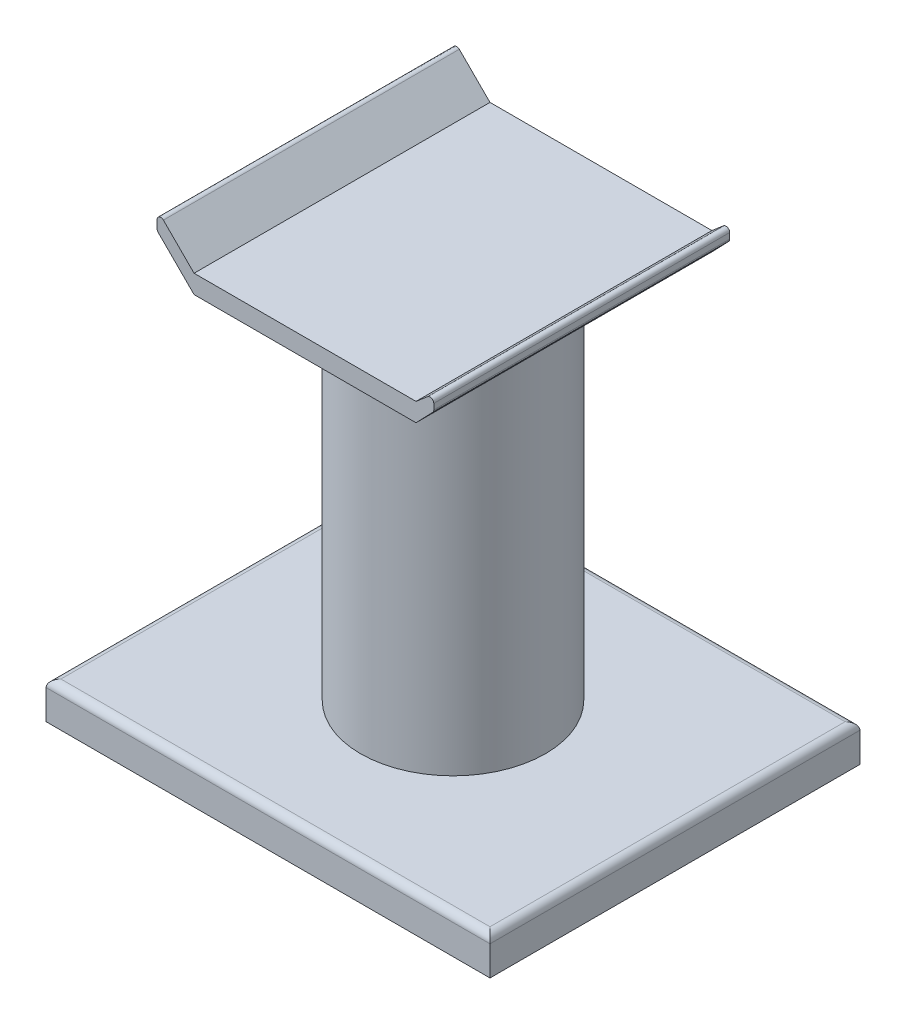
ISO-10303-21;
HEADER;
FILE_DESCRIPTION(('STEP AP214'),'2;1');
FILE_NAME('part.step','',(''),(''),'','','');
FILE_SCHEMA(('AUTOMOTIVE_DESIGN { 1 0 10303 214 1 1 1 1 }'));
ENDSEC;
DATA;
#1=APPLICATION_CONTEXT('core data for automotive mechanical design processes');
#2=APPLICATION_PROTOCOL_DEFINITION('international standard','automotive_design',2000,#1);
#3=PRODUCT_CONTEXT('',#1,'mechanical');
#4=PRODUCT('Part','Part','',(#3));
#5=PRODUCT_RELATED_PRODUCT_CATEGORY('part','',(#4));
#6=PRODUCT_DEFINITION_FORMATION('','',#4);
#7=PRODUCT_DEFINITION_CONTEXT('part definition',#1,'design');
#8=PRODUCT_DEFINITION('design','',#6,#7);
#9=PRODUCT_DEFINITION_SHAPE('','',#8);
#10=(LENGTH_UNIT() NAMED_UNIT(*) SI_UNIT(.MILLI.,.METRE.));
#11=(NAMED_UNIT(*) PLANE_ANGLE_UNIT() SI_UNIT($,.RADIAN.));
#12=(NAMED_UNIT(*) SI_UNIT($,.STERADIAN.) SOLID_ANGLE_UNIT());
#13=UNCERTAINTY_MEASURE_WITH_UNIT(LENGTH_MEASURE(1.E-05),#10,'distance_accuracy_value','');
#14=(GEOMETRIC_REPRESENTATION_CONTEXT(3) GLOBAL_UNCERTAINTY_ASSIGNED_CONTEXT((#13)) GLOBAL_UNIT_ASSIGNED_CONTEXT((#10,
#11,#12)) REPRESENTATION_CONTEXT('',''));
#15=CARTESIAN_POINT('',(0.,0.,0.));
#16=DIRECTION('',(0.,0.,1.));
#17=DIRECTION('',(1.,0.,0.));
#18=AXIS2_PLACEMENT_3D('',#15,#16,#17);
#19=CARTESIAN_POINT('',(0.,8.,-48.));
#20=DIRECTION('',(1.,0.,0.));
#21=DIRECTION('',(0.,0.,-1.));
#22=AXIS2_PLACEMENT_3D('',#19,#20,#21);
#23=CYLINDRICAL_SURFACE('',#22,2.);
#24=CARTESIAN_POINT('',(-58.,8.,-48.));
#25=DIRECTION('',(0.707106781186547,0.,-0.707106781186547));
#26=DIRECTION('',(-0.707106781186547,0.,-0.707106781186547));
#27=AXIS2_PLACEMENT_3D('',#24,#25,#26);
#28=ELLIPSE('',#27,2.82842712474619,2.);
#29=CARTESIAN_POINT('',(-58.,10.,-48.));
#30=VERTEX_POINT('',#29);
#31=CARTESIAN_POINT('',(-60.,8.,-50.));
#32=VERTEX_POINT('',#31);
#33=EDGE_CURVE('E11',#30,#32,#28,.F.);
#34=ORIENTED_EDGE('',*,*,#33,.F.);
#35=DIRECTION('',(-1.,0.,0.));
#36=VECTOR('',#35,1.);
#37=CARTESIAN_POINT('',(0.,10.,-48.));
#38=LINE('',#37,#36);
#39=CARTESIAN_POINT('',(58.,10.,-48.));
#40=VERTEX_POINT('',#39);
#41=EDGE_CURVE('E290',#40,#30,#38,.T.);
#42=ORIENTED_EDGE('',*,*,#41,.F.);
#43=CARTESIAN_POINT('',(58.,8.,-48.));
#44=DIRECTION('',(0.707106781186548,0.,0.707106781186547));
#45=DIRECTION('',(0.707106781186547,0.,-0.707106781186547));
#46=AXIS2_PLACEMENT_3D('',#43,#44,#45);
#47=ELLIPSE('',#46,2.82842712474619,2.);
#48=CARTESIAN_POINT('',(60.,8.,-50.));
#49=VERTEX_POINT('',#48);
#50=EDGE_CURVE('E46',#40,#49,#47,.F.);
#51=ORIENTED_EDGE('',*,*,#50,.T.);
#52=DIRECTION('',(-1.,0.,0.));
#53=VECTOR('',#52,1.);
#54=CARTESIAN_POINT('',(0.,8.,-50.));
#55=LINE('',#54,#53);
#56=EDGE_CURVE('E310',#32,#49,#55,.F.);
#57=ORIENTED_EDGE('',*,*,#56,.F.);
#58=EDGE_LOOP('',(#34,#42,#51,#57));
#59=FACE_BOUND('',#58,.T.);
#60=ADVANCED_FACE('F39',(#59),#23,.T.);
#61=CARTESIAN_POINT('',(58.,8.,0.));
#62=DIRECTION('',(0.,0.,1.));
#63=DIRECTION('',(1.,0.,0.));
#64=AXIS2_PLACEMENT_3D('',#61,#62,#63);
#65=CYLINDRICAL_SURFACE('',#64,2.);
#66=ORIENTED_EDGE('',*,*,#50,.F.);
#67=DIRECTION('',(0.,0.,-1.));
#68=VECTOR('',#67,1.);
#69=CARTESIAN_POINT('',(58.,10.,0.));
#70=LINE('',#69,#68);
#71=CARTESIAN_POINT('',(58.,10.,48.));
#72=VERTEX_POINT('',#71);
#73=EDGE_CURVE('E293',#72,#40,#70,.T.);
#74=ORIENTED_EDGE('',*,*,#73,.F.);
#75=CARTESIAN_POINT('',(58.,8.,48.));
#76=DIRECTION('',(-0.707106781186547,0.,0.707106781186548));
#77=DIRECTION('',(0.707106781186548,0.,0.707106781186547));
#78=AXIS2_PLACEMENT_3D('',#75,#76,#77);
#79=ELLIPSE('',#78,2.82842712474619,2.);
#80=CARTESIAN_POINT('',(60.,8.,50.));
#81=VERTEX_POINT('',#80);
#82=EDGE_CURVE('E60',#72,#81,#79,.F.);
#83=ORIENTED_EDGE('',*,*,#82,.T.);
#84=DIRECTION('',(0.,0.,-1.));
#85=VECTOR('',#84,1.);
#86=CARTESIAN_POINT('',(60.,8.,0.));
#87=LINE('',#86,#85);
#88=EDGE_CURVE('E308',#49,#81,#87,.F.);
#89=ORIENTED_EDGE('',*,*,#88,.F.);
#90=EDGE_LOOP('',(#66,#74,#83,#89));
#91=FACE_BOUND('',#90,.T.);
#92=ADVANCED_FACE('F338',(#91),#65,.T.);
#93=CARTESIAN_POINT('',(0.,8.,48.));
#94=DIRECTION('',(-1.,0.,0.));
#95=DIRECTION('',(0.,0.,1.));
#96=AXIS2_PLACEMENT_3D('',#93,#94,#95);
#97=CYLINDRICAL_SURFACE('',#96,2.);
#98=ORIENTED_EDGE('',*,*,#82,.F.);
#99=DIRECTION('',(1.,0.,0.));
#100=VECTOR('',#99,1.);
#101=CARTESIAN_POINT('',(0.,10.,48.));
#102=LINE('',#101,#100);
#103=CARTESIAN_POINT('',(-58.,10.,48.));
#104=VERTEX_POINT('',#103);
#105=EDGE_CURVE('E296',#104,#72,#102,.T.);
#106=ORIENTED_EDGE('',*,*,#105,.F.);
#107=CARTESIAN_POINT('',(-58.,8.,48.));
#108=DIRECTION('',(-0.707106781186547,0.,-0.707106781186547));
#109=DIRECTION('',(-0.707106781186547,0.,0.707106781186548));
#110=AXIS2_PLACEMENT_3D('',#107,#108,#109);
#111=ELLIPSE('',#110,2.82842712474619,2.);
#112=CARTESIAN_POINT('',(-60.,8.,50.));
#113=VERTEX_POINT('',#112);
#114=EDGE_CURVE('E312',#104,#113,#111,.F.);
#115=ORIENTED_EDGE('',*,*,#114,.T.);
#116=DIRECTION('',(1.,0.,0.));
#117=VECTOR('',#116,1.);
#118=CARTESIAN_POINT('',(0.,8.,50.));
#119=LINE('',#118,#117);
#120=EDGE_CURVE('E305',#81,#113,#119,.F.);
#121=ORIENTED_EDGE('',*,*,#120,.F.);
#122=EDGE_LOOP('',(#98,#106,#115,#121));
#123=FACE_BOUND('',#122,.T.);
#124=ADVANCED_FACE('F317',(#123),#97,.T.);
#125=CARTESIAN_POINT('',(-58.,8.,0.));
#126=DIRECTION('',(0.,0.,-1.));
#127=DIRECTION('',(-1.,0.,0.));
#128=AXIS2_PLACEMENT_3D('',#125,#126,#127);
#129=CYLINDRICAL_SURFACE('',#128,2.);
#130=DIRECTION('',(0.,0.,1.));
#131=VECTOR('',#130,1.);
#132=CARTESIAN_POINT('',(-58.,10.,0.));
#133=LINE('',#132,#131);
#134=EDGE_CURVE('E299',#30,#104,#133,.T.);
#135=ORIENTED_EDGE('',*,*,#134,.F.);
#136=ORIENTED_EDGE('',*,*,#33,.T.);
#137=DIRECTION('',(0.,0.,1.));
#138=VECTOR('',#137,1.);
#139=CARTESIAN_POINT('',(-60.,8.,0.));
#140=LINE('',#139,#138);
#141=EDGE_CURVE('E302',#113,#32,#140,.F.);
#142=ORIENTED_EDGE('',*,*,#141,.F.);
#143=ORIENTED_EDGE('',*,*,#114,.F.);
#144=EDGE_LOOP('',(#135,#136,#142,#143));
#145=FACE_BOUND('',#144,.T.);
#146=ADVANCED_FACE('F325',(#145),#129,.T.);
#147=CARTESIAN_POINT('',(33.8051684111036,115.402622656779,-40.0000000000001));
#148=DIRECTION('',(0.,0.,-1.));
#149=DIRECTION('',(-1.,0.,0.));
#150=AXIS2_PLACEMENT_3D('',#147,#148,#149);
#151=CYLINDRICAL_SURFACE('',#150,1.);
#152=DIRECTION('',(0.,0.,-1.));
#153=VECTOR('',#152,1.);
#154=CARTESIAN_POINT('',(34.8051684111036,115.402622656779,-40.0000000000001));
#155=LINE('',#154,#153);
#156=CARTESIAN_POINT('',(34.8051684111036,115.402622656779,40.));
#157=VERTEX_POINT('',#156);
#158=CARTESIAN_POINT('',(34.8051684111036,115.402622656779,-40.0000000000001));
#159=VERTEX_POINT('',#158);
#160=EDGE_CURVE('E282',#157,#159,#155,.T.);
#161=ORIENTED_EDGE('',*,*,#160,.F.);
#162=CARTESIAN_POINT('',(33.8051684111036,115.402622656779,40.));
#163=DIRECTION('',(0.,0.,-1.));
#164=DIRECTION('',(-1.,0.,0.));
#165=AXIS2_PLACEMENT_3D('',#162,#163,#164);
#166=CIRCLE('',#165,1.);
#167=CARTESIAN_POINT('',(34.5261832880233,114.709703074677,40.));
#168=VERTEX_POINT('',#167);
#169=EDGE_CURVE('E286',#168,#157,#166,.F.);
#170=ORIENTED_EDGE('',*,*,#169,.F.);
#171=DIRECTION('',(0.,0.,-1.));
#172=VECTOR('',#171,1.);
#173=CARTESIAN_POINT('',(34.5261832880233,114.709703074677,-40.0000000000001));
#174=LINE('',#173,#172);
#175=CARTESIAN_POINT('',(34.5261832880233,114.709703074677,-40.0000000000001));
#176=VERTEX_POINT('',#175);
#177=EDGE_CURVE('E189',#176,#168,#174,.F.);
#178=ORIENTED_EDGE('',*,*,#177,.F.);
#179=CARTESIAN_POINT('',(33.8051684111036,115.402622656779,-40.));
#180=DIRECTION('',(0.,0.,1.));
#181=DIRECTION('',(1.,0.,0.));
#182=AXIS2_PLACEMENT_3D('',#179,#180,#181);
#183=CIRCLE('',#182,1.);
#184=EDGE_CURVE('E288',#159,#176,#183,.F.);
#185=ORIENTED_EDGE('',*,*,#184,.F.);
#186=EDGE_LOOP('',(#161,#170,#178,#185));
#187=FACE_BOUND('',#186,.T.);
#188=ADVANCED_FACE('F364',(#187),#151,.T.);
#189=CARTESIAN_POINT('',(-39.,120.414213562373,-40.));
#190=DIRECTION('',(0.,0.,1.));
#191=DIRECTION('',(1.,0.,0.));
#192=AXIS2_PLACEMENT_3D('',#189,#190,#191);
#193=CYLINDRICAL_SURFACE('',#192,1.);
#194=DIRECTION('',(0.,0.,1.));
#195=VECTOR('',#194,1.);
#196=CARTESIAN_POINT('',(-40.,120.414213562373,-40.));
#197=LINE('',#196,#195);
#198=CARTESIAN_POINT('',(-40.,120.414213562373,-40.));
#199=VERTEX_POINT('',#198);
#200=CARTESIAN_POINT('',(-40.,120.414213562373,40.));
#201=VERTEX_POINT('',#200);
#202=EDGE_CURVE('E272',#199,#201,#197,.T.);
#203=ORIENTED_EDGE('',*,*,#202,.F.);
#204=CARTESIAN_POINT('',(-39.,120.414213562373,-40.));
#205=DIRECTION('',(0.,0.,1.));
#206=DIRECTION('',(1.,0.,0.));
#207=AXIS2_PLACEMENT_3D('',#204,#205,#206);
#208=CIRCLE('',#207,1.);
#209=CARTESIAN_POINT('',(-39.7071067811865,119.707106781187,-40.));
#210=VERTEX_POINT('',#209);
#211=EDGE_CURVE('E278',#210,#199,#208,.F.);
#212=ORIENTED_EDGE('',*,*,#211,.F.);
#213=DIRECTION('',(0.,0.,1.));
#214=VECTOR('',#213,1.);
#215=CARTESIAN_POINT('',(-39.7071067811865,119.707106781187,-40.));
#216=LINE('',#215,#214);
#217=CARTESIAN_POINT('',(-39.7071067811865,119.707106781187,40.));
#218=VERTEX_POINT('',#217);
#219=EDGE_CURVE('E275',#218,#210,#216,.F.);
#220=ORIENTED_EDGE('',*,*,#219,.F.);
#221=CARTESIAN_POINT('',(-39.,120.414213562373,40.));
#222=DIRECTION('',(0.,0.,-1.));
#223=DIRECTION('',(-1.,0.,0.));
#224=AXIS2_PLACEMENT_3D('',#221,#222,#223);
#225=CIRCLE('',#224,1.);
#226=EDGE_CURVE('E280',#201,#218,#225,.F.);
#227=ORIENTED_EDGE('',*,*,#226,.F.);
#228=EDGE_LOOP('',(#203,#212,#220,#227));
#229=FACE_BOUND('',#228,.T.);
#230=ADVANCED_FACE('F367',(#229),#193,.T.);
#231=CARTESIAN_POINT('',(33.8051684111036,116.93907036714,-40.0000000000001));
#232=DIRECTION('',(0.,0.,-1.));
#233=DIRECTION('',(-1.,0.,0.));
#234=AXIS2_PLACEMENT_3D('',#231,#232,#233);
#235=CYLINDRICAL_SURFACE('',#234,1.);
#236=DIRECTION('',(0.,0.,-1.));
#237=VECTOR('',#236,1.);
#238=CARTESIAN_POINT('',(33.1551306287074,117.698972256503,-40.0000000000001));
#239=LINE('',#238,#237);
#240=CARTESIAN_POINT('',(33.1551306287074,117.698972256503,40.));
#241=VERTEX_POINT('',#240);
#242=CARTESIAN_POINT('',(33.1551306287074,117.698972256503,-40.0000000000001));
#243=VERTEX_POINT('',#242);
#244=EDGE_CURVE('E261',#241,#243,#239,.T.);
#245=ORIENTED_EDGE('',*,*,#244,.F.);
#246=CARTESIAN_POINT('',(33.8051684111036,116.93907036714,40.));
#247=DIRECTION('',(0.,0.,-1.));
#248=DIRECTION('',(-1.,0.,0.));
#249=AXIS2_PLACEMENT_3D('',#246,#247,#248);
#250=CIRCLE('',#249,1.);
#251=CARTESIAN_POINT('',(34.8051684111036,116.93907036714,40.));
#252=VERTEX_POINT('',#251);
#253=EDGE_CURVE('E267',#252,#241,#250,.F.);
#254=ORIENTED_EDGE('',*,*,#253,.F.);
#255=DIRECTION('',(0.,0.,-1.));
#256=VECTOR('',#255,1.);
#257=CARTESIAN_POINT('',(34.8051684111036,116.93907036714,-40.0000000000001));
#258=LINE('',#257,#256);
#259=CARTESIAN_POINT('',(34.8051684111036,116.93907036714,-40.0000000000001));
#260=VERTEX_POINT('',#259);
#261=EDGE_CURVE('E264',#260,#252,#258,.F.);
#262=ORIENTED_EDGE('',*,*,#261,.F.);
#263=CARTESIAN_POINT('',(33.8051684111036,116.93907036714,-40.));
#264=DIRECTION('',(0.,0.,1.));
#265=DIRECTION('',(1.,0.,0.));
#266=AXIS2_PLACEMENT_3D('',#263,#264,#265);
#267=CIRCLE('',#266,1.);
#268=EDGE_CURVE('E269',#243,#260,#267,.F.);
#269=ORIENTED_EDGE('',*,*,#268,.F.);
#270=EDGE_LOOP('',(#245,#254,#262,#269));
#271=FACE_BOUND('',#270,.T.);
#272=ADVANCED_FACE('F371',(#271),#235,.T.);
#273=CARTESIAN_POINT('',(-39.,122.585786437627,-40.));
#274=DIRECTION('',(0.,0.,1.));
#275=DIRECTION('',(1.,0.,0.));
#276=AXIS2_PLACEMENT_3D('',#273,#274,#275);
#277=CYLINDRICAL_SURFACE('',#276,1.);
#278=DIRECTION('',(0.,0.,1.));
#279=VECTOR('',#278,1.);
#280=CARTESIAN_POINT('',(-38.2928932188134,123.292893218813,-40.));
#281=LINE('',#280,#279);
#282=CARTESIAN_POINT('',(-38.2928932188134,123.292893218813,-40.));
#283=VERTEX_POINT('',#282);
#284=CARTESIAN_POINT('',(-38.2928932188134,123.292893218813,40.));
#285=VERTEX_POINT('',#284);
#286=EDGE_CURVE('E232',#283,#285,#281,.T.);
#287=ORIENTED_EDGE('',*,*,#286,.F.);
#288=CARTESIAN_POINT('',(-39.,122.585786437627,-40.));
#289=DIRECTION('',(0.,0.,1.));
#290=DIRECTION('',(1.,0.,0.));
#291=AXIS2_PLACEMENT_3D('',#288,#289,#290);
#292=CIRCLE('',#291,1.);
#293=CARTESIAN_POINT('',(-40.,122.585786437627,-40.));
#294=VERTEX_POINT('',#293);
#295=EDGE_CURVE('E257',#294,#283,#292,.F.);
#296=ORIENTED_EDGE('',*,*,#295,.F.);
#297=DIRECTION('',(0.,0.,1.));
#298=VECTOR('',#297,1.);
#299=CARTESIAN_POINT('',(-40.,122.585786437627,-40.));
#300=LINE('',#299,#298);
#301=CARTESIAN_POINT('',(-40.,122.585786437627,40.));
#302=VERTEX_POINT('',#301);
#303=EDGE_CURVE('E254',#302,#294,#300,.F.);
#304=ORIENTED_EDGE('',*,*,#303,.F.);
#305=CARTESIAN_POINT('',(-39.,122.585786437627,40.));
#306=DIRECTION('',(0.,0.,-1.));
#307=DIRECTION('',(-1.,0.,0.));
#308=AXIS2_PLACEMENT_3D('',#305,#306,#307);
#309=CIRCLE('',#308,1.);
#310=EDGE_CURVE('E259',#285,#302,#309,.F.);
#311=ORIENTED_EDGE('',*,*,#310,.F.);
#312=EDGE_LOOP('',(#287,#296,#304,#311));
#313=FACE_BOUND('',#312,.T.);
#314=ADVANCED_FACE('F351',(#313),#277,.T.);
#315=CARTESIAN_POINT('',(60.,10.,-50.));
#316=DIRECTION('',(-1.,0.,0.));
#317=DIRECTION('',(0.,0.,1.));
#318=AXIS2_PLACEMENT_3D('',#315,#316,#317);
#319=PLANE('',#318);
#320=DIRECTION('',(0.,-1.,0.));
#321=VECTOR('',#320,1.);
#322=CARTESIAN_POINT('',(60.,10.,-50.));
#323=LINE('',#322,#321);
#324=CARTESIAN_POINT('',(60.,0.,-50.));
#325=VERTEX_POINT('',#324);
#326=EDGE_CURVE('E233',#49,#325,#323,.T.);
#327=ORIENTED_EDGE('',*,*,#326,.F.);
#328=ORIENTED_EDGE('',*,*,#88,.T.);
#329=DIRECTION('',(0.,-1.,0.));
#330=VECTOR('',#329,1.);
#331=CARTESIAN_POINT('',(60.,10.,50.));
#332=LINE('',#331,#330);
#333=CARTESIAN_POINT('',(60.,0.,50.));
#334=VERTEX_POINT('',#333);
#335=EDGE_CURVE('E245',#81,#334,#332,.T.);
#336=ORIENTED_EDGE('',*,*,#335,.T.);
#337=DIRECTION('',(0.,0.,-1.));
#338=VECTOR('',#337,1.);
#339=CARTESIAN_POINT('',(60.,0.,-50.));
#340=LINE('',#339,#338);
#341=EDGE_CURVE('E228',#334,#325,#340,.T.);
#342=ORIENTED_EDGE('',*,*,#341,.T.);
#343=EDGE_LOOP('',(#327,#328,#336,#342));
#344=FACE_BOUND('',#343,.T.);
#345=ADVANCED_FACE('F337',(#344),#319,.F.);
#346=CARTESIAN_POINT('',(-60.,10.,-50.));
#347=DIRECTION('',(0.,0.,1.));
#348=DIRECTION('',(1.,0.,0.));
#349=AXIS2_PLACEMENT_3D('',#346,#347,#348);
#350=PLANE('',#349);
#351=DIRECTION('',(0.,-1.,0.));
#352=VECTOR('',#351,1.);
#353=CARTESIAN_POINT('',(-60.,10.,-50.));
#354=LINE('',#353,#352);
#355=CARTESIAN_POINT('',(-60.,0.,-50.));
#356=VERTEX_POINT('',#355);
#357=EDGE_CURVE('E249',#32,#356,#354,.T.);
#358=ORIENTED_EDGE('',*,*,#357,.F.);
#359=ORIENTED_EDGE('',*,*,#56,.T.);
#360=ORIENTED_EDGE('',*,*,#326,.T.);
#361=DIRECTION('',(-1.,0.,0.));
#362=VECTOR('',#361,1.);
#363=CARTESIAN_POINT('',(-60.,0.,-50.));
#364=LINE('',#363,#362);
#365=EDGE_CURVE('E236',#325,#356,#364,.T.);
#366=ORIENTED_EDGE('',*,*,#365,.T.);
#367=EDGE_LOOP('',(#358,#359,#360,#366));
#368=FACE_BOUND('',#367,.T.);
#369=ADVANCED_FACE('F343',(#368),#350,.F.);
#370=CARTESIAN_POINT('',(-60.,10.,-50.));
#371=DIRECTION('',(1.,0.,0.));
#372=DIRECTION('',(0.,0.,-1.));
#373=AXIS2_PLACEMENT_3D('',#370,#371,#372);
#374=PLANE('',#373);
#375=DIRECTION('',(0.,-1.,0.));
#376=VECTOR('',#375,1.);
#377=CARTESIAN_POINT('',(-60.,10.,50.));
#378=LINE('',#377,#376);
#379=CARTESIAN_POINT('',(-60.,0.,50.));
#380=VERTEX_POINT('',#379);
#381=EDGE_CURVE('E247',#113,#380,#378,.T.);
#382=ORIENTED_EDGE('',*,*,#381,.F.);
#383=ORIENTED_EDGE('',*,*,#141,.T.);
#384=ORIENTED_EDGE('',*,*,#357,.T.);
#385=DIRECTION('',(0.,0.,1.));
#386=VECTOR('',#385,1.);
#387=CARTESIAN_POINT('',(-60.,0.,-50.));
#388=LINE('',#387,#386);
#389=EDGE_CURVE('E239',#356,#380,#388,.T.);
#390=ORIENTED_EDGE('',*,*,#389,.T.);
#391=EDGE_LOOP('',(#382,#383,#384,#390));
#392=FACE_BOUND('',#391,.T.);
#393=ADVANCED_FACE('F328',(#392),#374,.F.);
#394=CARTESIAN_POINT('',(-60.,10.,50.));
#395=DIRECTION('',(0.,0.,-1.));
#396=DIRECTION('',(-1.,0.,0.));
#397=AXIS2_PLACEMENT_3D('',#394,#395,#396);
#398=PLANE('',#397);
#399=ORIENTED_EDGE('',*,*,#335,.F.);
#400=ORIENTED_EDGE('',*,*,#120,.T.);
#401=ORIENTED_EDGE('',*,*,#381,.T.);
#402=DIRECTION('',(1.,0.,0.));
#403=VECTOR('',#402,1.);
#404=CARTESIAN_POINT('',(-60.,0.,50.));
#405=LINE('',#404,#403);
#406=EDGE_CURVE('E242',#380,#334,#405,.T.);
#407=ORIENTED_EDGE('',*,*,#406,.T.);
#408=EDGE_LOOP('',(#399,#400,#401,#407));
#409=FACE_BOUND('',#408,.T.);
#410=ADVANCED_FACE('F323',(#409),#398,.F.);
#411=CARTESIAN_POINT('',(0.,10.,0.));
#412=DIRECTION('',(0.,1.,0.));
#413=DIRECTION('',(0.,0.,1.));
#414=AXIS2_PLACEMENT_3D('',#411,#412,#413);
#415=PLANE('',#414);
#416=ORIENTED_EDGE('',*,*,#41,.T.);
#417=ORIENTED_EDGE('',*,*,#134,.T.);
#418=ORIENTED_EDGE('',*,*,#105,.T.);
#419=ORIENTED_EDGE('',*,*,#73,.T.);
#420=EDGE_LOOP('',(#416,#417,#418,#419));
#421=FACE_BOUND('',#420,.T.);
#422=CARTESIAN_POINT('',(0.,10.,0.));
#423=DIRECTION('',(0.,1.,0.));
#424=DIRECTION('',(0.,0.,1.));
#425=AXIS2_PLACEMENT_3D('',#422,#423,#424);
#426=CIRCLE('',#425,25.);
#427=CARTESIAN_POINT('',(0.,10.,25.));
#428=VERTEX_POINT('',#427);
#429=EDGE_CURVE('E229',#428,#428,#426,.T.);
#430=ORIENTED_EDGE('',*,*,#429,.F.);
#431=EDGE_LOOP('',(#430));
#432=FACE_BOUND('',#431,.T.);
#433=ADVANCED_FACE('F340',(#421,#432),#415,.T.);
#434=CARTESIAN_POINT('',(0.,0.,0.));
#435=DIRECTION('',(0.,1.,0.));
#436=DIRECTION('',(0.,0.,1.));
#437=AXIS2_PLACEMENT_3D('',#434,#435,#436);
#438=PLANE('',#437);
#439=ORIENTED_EDGE('',*,*,#341,.F.);
#440=ORIENTED_EDGE('',*,*,#406,.F.);
#441=ORIENTED_EDGE('',*,*,#389,.F.);
#442=ORIENTED_EDGE('',*,*,#365,.F.);
#443=EDGE_LOOP('',(#439,#440,#441,#442));
#444=FACE_BOUND('',#443,.T.);
#445=ADVANCED_FACE('F334',(#444),#438,.F.);
#446=CARTESIAN_POINT('',(0.,110.,0.));
#447=DIRECTION('',(0.,-1.,0.));
#448=DIRECTION('',(0.,0.,-1.));
#449=AXIS2_PLACEMENT_3D('',#446,#447,#448);
#450=CYLINDRICAL_SURFACE('',#449,25.);
#451=CARTESIAN_POINT('',(0.,110.,0.));
#452=DIRECTION('',(0.,1.,0.));
#453=DIRECTION('',(0.,0.,1.));
#454=AXIS2_PLACEMENT_3D('',#451,#452,#453);
#455=CIRCLE('',#454,25.);
#456=CARTESIAN_POINT('',(0.,110.,25.));
#457=VERTEX_POINT('',#456);
#458=EDGE_CURVE('E222',#457,#457,#455,.T.);
#459=ORIENTED_EDGE('',*,*,#458,.F.);
#460=EDGE_LOOP('',(#459));
#461=FACE_BOUND('',#460,.T.);
#462=ORIENTED_EDGE('',*,*,#429,.T.);
#463=EDGE_LOOP('',(#462));
#464=FACE_BOUND('',#463,.T.);
#465=ADVANCED_FACE('F441',(#461,#464),#450,.T.);
#466=CARTESIAN_POINT('',(-30.,115.,-40.));
#467=DIRECTION('',(0.,0.,1.));
#468=DIRECTION('',(1.,0.,0.));
#469=AXIS2_PLACEMENT_3D('',#466,#467,#468);
#470=PLANE('',#469);
#471=DIRECTION('',(0.,1.,0.));
#472=VECTOR('',#471,1.);
#473=CARTESIAN_POINT('',(34.8051684111036,119.110453022576,-40.0000000000001));
#474=LINE('',#473,#472);
#475=EDGE_CURVE('E407',#159,#260,#474,.T.);
#476=ORIENTED_EDGE('',*,*,#475,.F.);
#477=ORIENTED_EDGE('',*,*,#184,.T.);
#478=DIRECTION('',(0.692919582102049,0.721014876919694,0.));
#479=VECTOR('',#478,1.);
#480=CARTESIAN_POINT('',(34.8051684111036,115.,-40.0000000000001));
#481=LINE('',#480,#479);
#482=CARTESIAN_POINT('',(30.,110.,-40.));
#483=VERTEX_POINT('',#482);
#484=EDGE_CURVE('E199',#483,#176,#481,.T.);
#485=ORIENTED_EDGE('',*,*,#484,.F.);
#486=DIRECTION('',(-1.,0.,0.));
#487=VECTOR('',#486,1.);
#488=CARTESIAN_POINT('',(-30.,110.,-40.));
#489=LINE('',#488,#487);
#490=CARTESIAN_POINT('',(-30.,110.,-40.));
#491=VERTEX_POINT('',#490);
#492=EDGE_CURVE('E170',#483,#491,#489,.T.);
#493=ORIENTED_EDGE('',*,*,#492,.T.);
#494=DIRECTION('',(0.707106781186548,-0.707106781186547,0.));
#495=VECTOR('',#494,1.);
#496=CARTESIAN_POINT('',(-40.,120.,-40.));
#497=LINE('',#496,#495);
#498=EDGE_CURVE('E175',#210,#491,#497,.T.);
#499=ORIENTED_EDGE('',*,*,#498,.F.);
#500=ORIENTED_EDGE('',*,*,#211,.T.);
#501=DIRECTION('',(0.,-1.,0.));
#502=VECTOR('',#501,1.);
#503=CARTESIAN_POINT('',(-40.,125.,-40.));
#504=LINE('',#503,#502);
#505=EDGE_CURVE('E203',#294,#199,#504,.T.);
#506=ORIENTED_EDGE('',*,*,#505,.F.);
#507=ORIENTED_EDGE('',*,*,#295,.T.);
#508=DIRECTION('',(-0.707106781186548,0.707106781186547,0.));
#509=VECTOR('',#508,1.);
#510=CARTESIAN_POINT('',(-40.,125.,-40.));
#511=LINE('',#510,#509);
#512=CARTESIAN_POINT('',(-30.,115.,-40.));
#513=VERTEX_POINT('',#512);
#514=EDGE_CURVE('E200',#513,#283,#511,.T.);
#515=ORIENTED_EDGE('',*,*,#514,.F.);
#516=DIRECTION('',(-1.,0.,0.));
#517=VECTOR('',#516,1.);
#518=CARTESIAN_POINT('',(-30.,115.,-40.));
#519=LINE('',#518,#517);
#520=CARTESIAN_POINT('',(30.,115.,-40.));
#521=VERTEX_POINT('',#520);
#522=EDGE_CURVE('E216',#521,#513,#519,.T.);
#523=ORIENTED_EDGE('',*,*,#522,.F.);
#524=DIRECTION('',(-0.759901889363032,-0.650037782396142,0.));
#525=VECTOR('',#524,1.);
#526=CARTESIAN_POINT('',(30.,115.,-40.0000000000001));
#527=LINE('',#526,#525);
#528=EDGE_CURVE('E195',#243,#521,#527,.T.);
#529=ORIENTED_EDGE('',*,*,#528,.F.);
#530=ORIENTED_EDGE('',*,*,#268,.T.);
#531=EDGE_LOOP('',(#476,#477,#485,#493,#499,#500,#506,#507,#515,#523,#529,#530));
#532=FACE_BOUND('',#531,.T.);
#533=ADVANCED_FACE('F390',(#532),#470,.F.);
#534=CARTESIAN_POINT('',(-30.,115.,40.));
#535=DIRECTION('',(0.,0.,-1.));
#536=DIRECTION('',(-1.,0.,0.));
#537=AXIS2_PLACEMENT_3D('',#534,#535,#536);
#538=PLANE('',#537);
#539=DIRECTION('',(0.692919582102049,0.721014876919694,0.));
#540=VECTOR('',#539,1.);
#541=CARTESIAN_POINT('',(34.8051684111036,115.,40.));
#542=LINE('',#541,#540);
#543=CARTESIAN_POINT('',(30.,110.,40.));
#544=VERTEX_POINT('',#543);
#545=EDGE_CURVE('E180',#544,#168,#542,.T.);
#546=ORIENTED_EDGE('',*,*,#545,.T.);
#547=ORIENTED_EDGE('',*,*,#169,.T.);
#548=DIRECTION('',(0.,1.,0.));
#549=VECTOR('',#548,1.);
#550=CARTESIAN_POINT('',(34.8051684111036,119.110453022576,40.));
#551=LINE('',#550,#549);
#552=EDGE_CURVE('E190',#157,#252,#551,.T.);
#553=ORIENTED_EDGE('',*,*,#552,.T.);
#554=ORIENTED_EDGE('',*,*,#253,.T.);
#555=DIRECTION('',(-0.759901889363032,-0.650037782396142,0.));
#556=VECTOR('',#555,1.);
#557=CARTESIAN_POINT('',(30.,115.,40.));
#558=LINE('',#557,#556);
#559=CARTESIAN_POINT('',(30.,115.,40.));
#560=VERTEX_POINT('',#559);
#561=EDGE_CURVE('E192',#241,#560,#558,.T.);
#562=ORIENTED_EDGE('',*,*,#561,.T.);
#563=DIRECTION('',(1.,0.,0.));
#564=VECTOR('',#563,1.);
#565=CARTESIAN_POINT('',(-30.,115.,40.));
#566=LINE('',#565,#564);
#567=CARTESIAN_POINT('',(-30.,115.,40.));
#568=VERTEX_POINT('',#567);
#569=EDGE_CURVE('E220',#568,#560,#566,.T.);
#570=ORIENTED_EDGE('',*,*,#569,.F.);
#571=DIRECTION('',(-0.707106781186548,0.707106781186547,0.));
#572=VECTOR('',#571,1.);
#573=CARTESIAN_POINT('',(-40.,125.,40.));
#574=LINE('',#573,#572);
#575=EDGE_CURVE('E207',#568,#285,#574,.T.);
#576=ORIENTED_EDGE('',*,*,#575,.T.);
#577=ORIENTED_EDGE('',*,*,#310,.T.);
#578=DIRECTION('',(0.,-1.,0.));
#579=VECTOR('',#578,1.);
#580=CARTESIAN_POINT('',(-40.,125.,40.));
#581=LINE('',#580,#579);
#582=EDGE_CURVE('E210',#302,#201,#581,.T.);
#583=ORIENTED_EDGE('',*,*,#582,.T.);
#584=ORIENTED_EDGE('',*,*,#226,.T.);
#585=DIRECTION('',(0.707106781186548,-0.707106781186547,0.));
#586=VECTOR('',#585,1.);
#587=CARTESIAN_POINT('',(-40.,120.,40.));
#588=LINE('',#587,#586);
#589=CARTESIAN_POINT('',(-30.,110.,40.));
#590=VERTEX_POINT('',#589);
#591=EDGE_CURVE('E182',#218,#590,#588,.T.);
#592=ORIENTED_EDGE('',*,*,#591,.T.);
#593=DIRECTION('',(1.,0.,0.));
#594=VECTOR('',#593,1.);
#595=CARTESIAN_POINT('',(-30.,110.,40.));
#596=LINE('',#595,#594);
#597=EDGE_CURVE('E167',#590,#544,#596,.T.);
#598=ORIENTED_EDGE('',*,*,#597,.T.);
#599=EDGE_LOOP('',(#546,#547,#553,#554,#562,#570,#576,#577,#583,#584,#592,#598));
#600=FACE_BOUND('',#599,.T.);
#601=ADVANCED_FACE('F179',(#600),#538,.F.);
#602=CARTESIAN_POINT('',(0.,115.,0.));
#603=DIRECTION('',(0.,1.,0.));
#604=DIRECTION('',(0.,0.,1.));
#605=AXIS2_PLACEMENT_3D('',#602,#603,#604);
#606=PLANE('',#605);
#607=DIRECTION('',(0.,0.,-1.));
#608=VECTOR('',#607,1.);
#609=CARTESIAN_POINT('',(30.,115.,-40.));
#610=LINE('',#609,#608);
#611=EDGE_CURVE('E183',#560,#521,#610,.T.);
#612=ORIENTED_EDGE('',*,*,#611,.T.);
#613=ORIENTED_EDGE('',*,*,#522,.T.);
#614=DIRECTION('',(0.,0.,1.));
#615=VECTOR('',#614,1.);
#616=CARTESIAN_POINT('',(-30.,115.,-40.));
#617=LINE('',#616,#615);
#618=EDGE_CURVE('E218',#513,#568,#617,.T.);
#619=ORIENTED_EDGE('',*,*,#618,.T.);
#620=ORIENTED_EDGE('',*,*,#569,.T.);
#621=EDGE_LOOP('',(#612,#613,#619,#620));
#622=FACE_BOUND('',#621,.T.);
#623=ADVANCED_FACE('F403',(#622),#606,.T.);
#624=CARTESIAN_POINT('',(0.,110.,0.));
#625=DIRECTION('',(0.,1.,0.));
#626=DIRECTION('',(0.,0.,1.));
#627=AXIS2_PLACEMENT_3D('',#624,#625,#626);
#628=PLANE('',#627);
#629=ORIENTED_EDGE('',*,*,#458,.T.);
#630=EDGE_LOOP('',(#629));
#631=FACE_BOUND('',#630,.T.);
#632=DIRECTION('',(0.,0.,-1.));
#633=VECTOR('',#632,1.);
#634=CARTESIAN_POINT('',(30.,110.,-40.));
#635=LINE('',#634,#633);
#636=EDGE_CURVE('E163',#544,#483,#635,.T.);
#637=ORIENTED_EDGE('',*,*,#636,.F.);
#638=ORIENTED_EDGE('',*,*,#597,.F.);
#639=DIRECTION('',(0.,0.,1.));
#640=VECTOR('',#639,1.);
#641=CARTESIAN_POINT('',(-30.,110.,-40.));
#642=LINE('',#641,#640);
#643=EDGE_CURVE('E184',#491,#590,#642,.T.);
#644=ORIENTED_EDGE('',*,*,#643,.F.);
#645=ORIENTED_EDGE('',*,*,#492,.F.);
#646=EDGE_LOOP('',(#637,#638,#644,#645));
#647=FACE_BOUND('',#646,.T.);
#648=ADVANCED_FACE('F165',(#631,#647),#628,.F.);
#649=CARTESIAN_POINT('',(-40.,120.,-40.));
#650=DIRECTION('',(-0.707106781186547,-0.707106781186548,0.));
#651=DIRECTION('',(0.707106781186548,-0.707106781186547,0.));
#652=AXIS2_PLACEMENT_3D('',#649,#650,#651);
#653=PLANE('',#652);
#654=ORIENTED_EDGE('',*,*,#591,.F.);
#655=ORIENTED_EDGE('',*,*,#219,.T.);
#656=ORIENTED_EDGE('',*,*,#498,.T.);
#657=ORIENTED_EDGE('',*,*,#643,.T.);
#658=EDGE_LOOP('',(#654,#655,#656,#657));
#659=FACE_BOUND('',#658,.T.);
#660=ADVANCED_FACE('F424',(#659),#653,.T.);
#661=CARTESIAN_POINT('',(-40.,125.,-40.));
#662=DIRECTION('',(-1.,0.,0.));
#663=DIRECTION('',(0.,0.,1.));
#664=AXIS2_PLACEMENT_3D('',#661,#662,#663);
#665=PLANE('',#664);
#666=ORIENTED_EDGE('',*,*,#505,.T.);
#667=ORIENTED_EDGE('',*,*,#202,.T.);
#668=ORIENTED_EDGE('',*,*,#582,.F.);
#669=ORIENTED_EDGE('',*,*,#303,.T.);
#670=EDGE_LOOP('',(#666,#667,#668,#669));
#671=FACE_BOUND('',#670,.T.);
#672=ADVANCED_FACE('F396',(#671),#665,.T.);
#673=CARTESIAN_POINT('',(-40.,125.,-40.));
#674=DIRECTION('',(0.707106781186547,0.707106781186548,0.));
#675=DIRECTION('',(-0.707106781186548,0.707106781186547,0.));
#676=AXIS2_PLACEMENT_3D('',#673,#674,#675);
#677=PLANE('',#676);
#678=ORIENTED_EDGE('',*,*,#514,.T.);
#679=ORIENTED_EDGE('',*,*,#286,.T.);
#680=ORIENTED_EDGE('',*,*,#575,.F.);
#681=ORIENTED_EDGE('',*,*,#618,.F.);
#682=EDGE_LOOP('',(#678,#679,#680,#681));
#683=FACE_BOUND('',#682,.T.);
#684=ADVANCED_FACE('F386',(#683),#677,.T.);
#685=CARTESIAN_POINT('',(30.,115.,-40.0000000000001));
#686=DIRECTION('',(-0.650037782396142,0.759901889363032,0.));
#687=DIRECTION('',(-0.759901889363032,-0.650037782396142,0.));
#688=AXIS2_PLACEMENT_3D('',#685,#686,#687);
#689=PLANE('',#688);
#690=ORIENTED_EDGE('',*,*,#561,.F.);
#691=ORIENTED_EDGE('',*,*,#244,.T.);
#692=ORIENTED_EDGE('',*,*,#528,.T.);
#693=ORIENTED_EDGE('',*,*,#611,.F.);
#694=EDGE_LOOP('',(#690,#691,#692,#693));
#695=FACE_BOUND('',#694,.T.);
#696=ADVANCED_FACE('F405',(#695),#689,.T.);
#697=CARTESIAN_POINT('',(34.8051684111036,119.110453022576,-40.0000000000001));
#698=DIRECTION('',(1.,0.,0.));
#699=DIRECTION('',(0.,0.,-1.));
#700=AXIS2_PLACEMENT_3D('',#697,#698,#699);
#701=PLANE('',#700);
#702=ORIENTED_EDGE('',*,*,#552,.F.);
#703=ORIENTED_EDGE('',*,*,#160,.T.);
#704=ORIENTED_EDGE('',*,*,#475,.T.);
#705=ORIENTED_EDGE('',*,*,#261,.T.);
#706=EDGE_LOOP('',(#702,#703,#704,#705));
#707=FACE_BOUND('',#706,.T.);
#708=ADVANCED_FACE('F414',(#707),#701,.T.);
#709=CARTESIAN_POINT('',(34.8051684111036,115.,-40.0000000000001));
#710=DIRECTION('',(0.721014876919694,-0.692919582102049,0.));
#711=DIRECTION('',(0.692919582102049,0.721014876919694,0.));
#712=AXIS2_PLACEMENT_3D('',#709,#710,#711);
#713=PLANE('',#712);
#714=ORIENTED_EDGE('',*,*,#484,.T.);
#715=ORIENTED_EDGE('',*,*,#177,.T.);
#716=ORIENTED_EDGE('',*,*,#545,.F.);
#717=ORIENTED_EDGE('',*,*,#636,.T.);
#718=EDGE_LOOP('',(#714,#715,#716,#717));
#719=FACE_BOUND('',#718,.T.);
#720=ADVANCED_FACE('F187',(#719),#713,.T.);
#721=CLOSED_SHELL('',(#60,#92,#124,#146,#188,#230,#272,#314,#345,#369,#393,#410,#433,#445,#465,
#533,#601,#623,#648,#660,#672,#684,#696,#708,#720));
#722=MANIFOLD_SOLID_BREP('B2',#721);
#723=ADVANCED_BREP_SHAPE_REPRESENTATION('',(#18,#722),#14);
#724=SHAPE_DEFINITION_REPRESENTATION(#9,#723);
ENDSEC;
END-ISO-10303-21;
